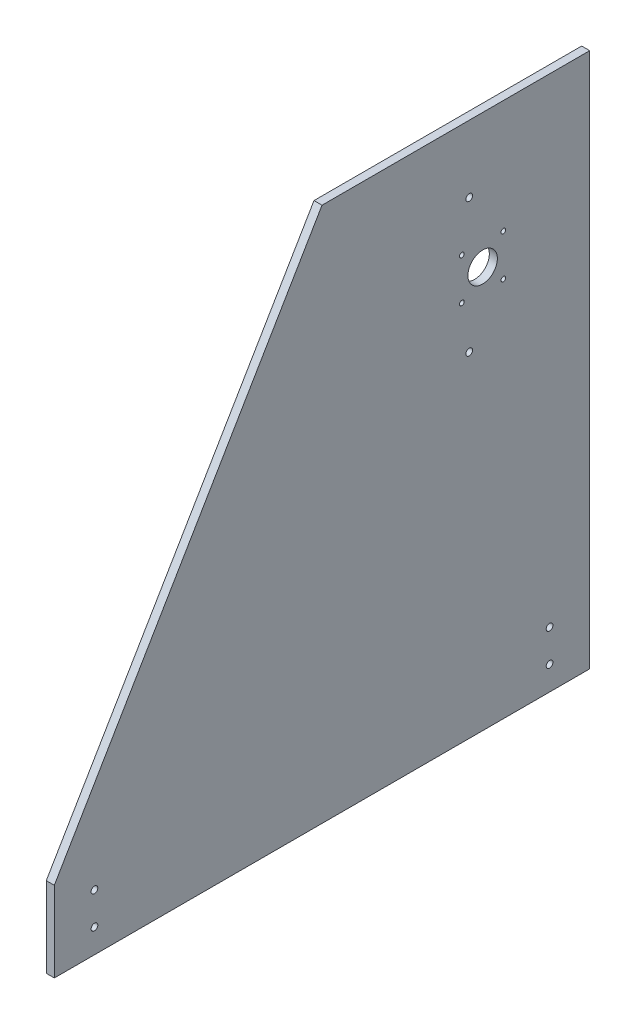
ISO-10303-21;
HEADER;
FILE_DESCRIPTION(('STEP AP214'),'2;1');
FILE_NAME('part.step','',(''),(''),'','','');
FILE_SCHEMA(('AUTOMOTIVE_DESIGN { 1 0 10303 214 1 1 1 1 }'));
ENDSEC;
DATA;
#1=APPLICATION_CONTEXT('core data for automotive mechanical design processes');
#2=APPLICATION_PROTOCOL_DEFINITION('international standard','automotive_design',2000,#1);
#3=PRODUCT_CONTEXT('',#1,'mechanical');
#4=PRODUCT('Part','Part','',(#3));
#5=PRODUCT_RELATED_PRODUCT_CATEGORY('part','',(#4));
#6=PRODUCT_DEFINITION_FORMATION('','',#4);
#7=PRODUCT_DEFINITION_CONTEXT('part definition',#1,'design');
#8=PRODUCT_DEFINITION('design','',#6,#7);
#9=PRODUCT_DEFINITION_SHAPE('','',#8);
#10=(LENGTH_UNIT() NAMED_UNIT(*) SI_UNIT(.MILLI.,.METRE.));
#11=(NAMED_UNIT(*) PLANE_ANGLE_UNIT() SI_UNIT($,.RADIAN.));
#12=(NAMED_UNIT(*) SI_UNIT($,.STERADIAN.) SOLID_ANGLE_UNIT());
#13=UNCERTAINTY_MEASURE_WITH_UNIT(LENGTH_MEASURE(1.E-05),#10,'distance_accuracy_value','');
#14=(GEOMETRIC_REPRESENTATION_CONTEXT(3) GLOBAL_UNCERTAINTY_ASSIGNED_CONTEXT((#13)) GLOBAL_UNIT_ASSIGNED_CONTEXT((#10,
#11,#12)) REPRESENTATION_CONTEXT('',''));
#15=CARTESIAN_POINT('',(0.,0.,0.));
#16=DIRECTION('',(0.,0.,1.));
#17=DIRECTION('',(1.,0.,0.));
#18=AXIS2_PLACEMENT_3D('',#15,#16,#17);
#19=CARTESIAN_POINT('',(6.,0.,0.));
#20=DIRECTION('',(1.,0.,0.));
#21=DIRECTION('',(0.,0.,-1.));
#22=AXIS2_PLACEMENT_3D('',#19,#20,#21);
#23=PLANE('',#22);
#24=CARTESIAN_POINT('',(6.,284.5,-304.5));
#25=DIRECTION('',(1.,0.,0.));
#26=DIRECTION('',(0.,0.,-1.));
#27=AXIS2_PLACEMENT_3D('',#24,#25,#26);
#28=CIRCLE('',#27,1.74999999999998);
#29=CARTESIAN_POINT('',(6.,284.5,-306.25));
#30=VERTEX_POINT('',#29);
#31=EDGE_CURVE('E203',#30,#30,#28,.T.);
#32=ORIENTED_EDGE('',*,*,#31,.F.);
#33=EDGE_LOOP('',(#32));
#34=FACE_BOUND('',#33,.T.);
#35=CARTESIAN_POINT('',(6.,315.5,-335.5));
#36=DIRECTION('',(1.,0.,0.));
#37=DIRECTION('',(0.,0.,-1.));
#38=AXIS2_PLACEMENT_3D('',#35,#36,#37);
#39=CIRCLE('',#38,1.74999999999998);
#40=CARTESIAN_POINT('',(6.,315.5,-337.25));
#41=VERTEX_POINT('',#40);
#42=EDGE_CURVE('E215',#41,#41,#39,.T.);
#43=ORIENTED_EDGE('',*,*,#42,.F.);
#44=EDGE_LOOP('',(#43));
#45=FACE_BOUND('',#44,.T.);
#46=CARTESIAN_POINT('',(6.,250.,-310.));
#47=DIRECTION('',(1.,0.,0.));
#48=DIRECTION('',(0.,0.,-1.));
#49=AXIS2_PLACEMENT_3D('',#46,#47,#48);
#50=CIRCLE('',#49,2.50000000000002);
#51=CARTESIAN_POINT('',(6.,250.,-312.5));
#52=VERTEX_POINT('',#51);
#53=EDGE_CURVE('E227',#52,#52,#50,.T.);
#54=ORIENTED_EDGE('',*,*,#53,.F.);
#55=EDGE_LOOP('',(#54));
#56=FACE_BOUND('',#55,.T.);
#57=CARTESIAN_POINT('',(6.,42.0000000000013,-370.));
#58=DIRECTION('',(1.,0.,0.));
#59=DIRECTION('',(0.,0.,1.));
#60=AXIS2_PLACEMENT_3D('',#57,#58,#59);
#61=CIRCLE('',#60,2.49999999999997);
#62=CARTESIAN_POINT('',(6.,42.0000000000013,-367.5));
#63=VERTEX_POINT('',#62);
#64=EDGE_CURVE('E239',#63,#63,#61,.T.);
#65=ORIENTED_EDGE('',*,*,#64,.F.);
#66=EDGE_LOOP('',(#65));
#67=FACE_BOUND('',#66,.T.);
#68=CARTESIAN_POINT('',(6.,18.,-30.));
#69=DIRECTION('',(1.,0.,0.));
#70=DIRECTION('',(0.,0.,1.));
#71=AXIS2_PLACEMENT_3D('',#68,#69,#70);
#72=CIRCLE('',#71,2.5);
#73=CARTESIAN_POINT('',(6.,18.,-27.5));
#74=VERTEX_POINT('',#73);
#75=EDGE_CURVE('E251',#74,#74,#72,.T.);
#76=ORIENTED_EDGE('',*,*,#75,.F.);
#77=EDGE_LOOP('',(#76));
#78=FACE_BOUND('',#77,.T.);
#79=DIRECTION('',(0.,-1.,0.));
#80=VECTOR('',#79,1.);
#81=CARTESIAN_POINT('',(6.,60.,0.));
#82=LINE('',#81,#80);
#83=CARTESIAN_POINT('',(6.,60.,0.));
#84=VERTEX_POINT('',#83);
#85=CARTESIAN_POINT('',(6.,0.,0.));
#86=VERTEX_POINT('',#85);
#87=EDGE_CURVE('E120',#84,#86,#82,.T.);
#88=ORIENTED_EDGE('',*,*,#87,.T.);
#89=DIRECTION('',(0.,0.,-1.));
#90=VECTOR('',#89,1.);
#91=CARTESIAN_POINT('',(6.,0.,0.));
#92=LINE('',#91,#90);
#93=CARTESIAN_POINT('',(6.,0.,-400.));
#94=VERTEX_POINT('',#93);
#95=EDGE_CURVE('E87',#86,#94,#92,.T.);
#96=ORIENTED_EDGE('',*,*,#95,.T.);
#97=DIRECTION('',(0.,1.,0.));
#98=VECTOR('',#97,1.);
#99=CARTESIAN_POINT('',(6.,0.,-400.));
#100=LINE('',#99,#98);
#101=CARTESIAN_POINT('',(6.,400.,-400.));
#102=VERTEX_POINT('',#101);
#103=EDGE_CURVE('E91',#94,#102,#100,.T.);
#104=ORIENTED_EDGE('',*,*,#103,.T.);
#105=DIRECTION('',(0.,0.,1.));
#106=VECTOR('',#105,1.);
#107=CARTESIAN_POINT('',(6.,400.,-200.));
#108=LINE('',#107,#106);
#109=CARTESIAN_POINT('',(6.,400.,-200.));
#110=VERTEX_POINT('',#109);
#111=EDGE_CURVE('E95',#102,#110,#108,.T.);
#112=ORIENTED_EDGE('',*,*,#111,.T.);
#113=DIRECTION('',(0.,-0.86193421515777,0.507020126563394));
#114=VECTOR('',#113,1.);
#115=CARTESIAN_POINT('',(6.,60.,0.));
#116=LINE('',#115,#114);
#117=EDGE_CURVE('E53',#110,#84,#116,.T.);
#118=ORIENTED_EDGE('',*,*,#117,.T.);
#119=EDGE_LOOP('',(#88,#96,#104,#112,#118));
#120=FACE_BOUND('',#119,.T.);
#121=CARTESIAN_POINT('',(6.,42.,-30.));
#122=DIRECTION('',(1.,0.,0.));
#123=DIRECTION('',(0.,0.,-1.));
#124=AXIS2_PLACEMENT_3D('',#121,#122,#123);
#125=CIRCLE('',#124,2.5);
#126=CARTESIAN_POINT('',(6.,42.,-32.5));
#127=VERTEX_POINT('',#126);
#128=EDGE_CURVE('E115',#127,#127,#125,.T.);
#129=ORIENTED_EDGE('',*,*,#128,.F.);
#130=EDGE_LOOP('',(#129));
#131=FACE_BOUND('',#130,.T.);
#132=CARTESIAN_POINT('',(6.,18.0000000000013,-370.));
#133=DIRECTION('',(1.,0.,0.));
#134=DIRECTION('',(0.,0.,-1.));
#135=AXIS2_PLACEMENT_3D('',#132,#133,#134);
#136=CIRCLE('',#135,2.49999999999997);
#137=CARTESIAN_POINT('',(6.,18.0000000000013,-372.5));
#138=VERTEX_POINT('',#137);
#139=EDGE_CURVE('E245',#138,#138,#136,.T.);
#140=ORIENTED_EDGE('',*,*,#139,.F.);
#141=EDGE_LOOP('',(#140));
#142=FACE_BOUND('',#141,.T.);
#143=CARTESIAN_POINT('',(6.,350.,-310.));
#144=DIRECTION('',(1.,0.,0.));
#145=DIRECTION('',(0.,0.,-1.));
#146=AXIS2_PLACEMENT_3D('',#143,#144,#145);
#147=CIRCLE('',#146,2.50000000000002);
#148=CARTESIAN_POINT('',(6.,350.,-312.5));
#149=VERTEX_POINT('',#148);
#150=EDGE_CURVE('E233',#149,#149,#147,.T.);
#151=ORIENTED_EDGE('',*,*,#150,.F.);
#152=EDGE_LOOP('',(#151));
#153=FACE_BOUND('',#152,.T.);
#154=CARTESIAN_POINT('',(6.,300.,-320.));
#155=DIRECTION('',(1.,0.,0.));
#156=DIRECTION('',(0.,0.,-1.));
#157=AXIS2_PLACEMENT_3D('',#154,#155,#156);
#158=CIRCLE('',#157,11.);
#159=CARTESIAN_POINT('',(6.,300.,-331.));
#160=VERTEX_POINT('',#159);
#161=EDGE_CURVE('E221',#160,#160,#158,.T.);
#162=ORIENTED_EDGE('',*,*,#161,.F.);
#163=EDGE_LOOP('',(#162));
#164=FACE_BOUND('',#163,.T.);
#165=CARTESIAN_POINT('',(6.,315.5,-304.5));
#166=DIRECTION('',(1.,0.,0.));
#167=DIRECTION('',(0.,0.,1.));
#168=AXIS2_PLACEMENT_3D('',#165,#166,#167);
#169=CIRCLE('',#168,1.74999999999998);
#170=CARTESIAN_POINT('',(6.,315.5,-302.75));
#171=VERTEX_POINT('',#170);
#172=EDGE_CURVE('E209',#171,#171,#169,.T.);
#173=ORIENTED_EDGE('',*,*,#172,.F.);
#174=EDGE_LOOP('',(#173));
#175=FACE_BOUND('',#174,.T.);
#176=CARTESIAN_POINT('',(6.,284.5,-335.5));
#177=DIRECTION('',(1.,0.,0.));
#178=DIRECTION('',(0.,0.,1.));
#179=AXIS2_PLACEMENT_3D('',#176,#177,#178);
#180=CIRCLE('',#179,1.74999999999998);
#181=CARTESIAN_POINT('',(6.,284.5,-333.75));
#182=VERTEX_POINT('',#181);
#183=EDGE_CURVE('E194',#182,#182,#180,.T.);
#184=ORIENTED_EDGE('',*,*,#183,.F.);
#185=EDGE_LOOP('',(#184));
#186=FACE_BOUND('',#185,.T.);
#187=ADVANCED_FACE('F36',(#34,#45,#56,#67,#78,#120,#131,#142,#153,#164,#175,#186),#23,.T.);
#188=CARTESIAN_POINT('',(0.,0.,0.));
#189=DIRECTION('',(1.,0.,0.));
#190=DIRECTION('',(0.,0.,-1.));
#191=AXIS2_PLACEMENT_3D('',#188,#189,#190);
#192=PLANE('',#191);
#193=DIRECTION('',(0.,-1.,0.));
#194=VECTOR('',#193,1.);
#195=CARTESIAN_POINT('',(0.,60.,0.));
#196=LINE('',#195,#194);
#197=CARTESIAN_POINT('',(0.,60.,0.));
#198=VERTEX_POINT('',#197);
#199=CARTESIAN_POINT('',(0.,0.,0.));
#200=VERTEX_POINT('',#199);
#201=EDGE_CURVE('E111',#198,#200,#196,.T.);
#202=ORIENTED_EDGE('',*,*,#201,.F.);
#203=DIRECTION('',(0.,-0.86193421515777,0.507020126563394));
#204=VECTOR('',#203,1.);
#205=CARTESIAN_POINT('',(0.,60.,0.));
#206=LINE('',#205,#204);
#207=CARTESIAN_POINT('',(0.,400.,-200.));
#208=VERTEX_POINT('',#207);
#209=EDGE_CURVE('E79',#208,#198,#206,.T.);
#210=ORIENTED_EDGE('',*,*,#209,.F.);
#211=DIRECTION('',(0.,0.,1.));
#212=VECTOR('',#211,1.);
#213=CARTESIAN_POINT('',(0.,400.,-200.));
#214=LINE('',#213,#212);
#215=CARTESIAN_POINT('',(0.,400.,-400.));
#216=VERTEX_POINT('',#215);
#217=EDGE_CURVE('E73',#216,#208,#214,.T.);
#218=ORIENTED_EDGE('',*,*,#217,.F.);
#219=DIRECTION('',(0.,1.,0.));
#220=VECTOR('',#219,1.);
#221=CARTESIAN_POINT('',(0.,0.,-400.));
#222=LINE('',#221,#220);
#223=CARTESIAN_POINT('',(0.,0.,-400.));
#224=VERTEX_POINT('',#223);
#225=EDGE_CURVE('E102',#224,#216,#222,.T.);
#226=ORIENTED_EDGE('',*,*,#225,.F.);
#227=DIRECTION('',(0.,0.,-1.));
#228=VECTOR('',#227,1.);
#229=CARTESIAN_POINT('',(0.,0.,0.));
#230=LINE('',#229,#228);
#231=EDGE_CURVE('E114',#200,#224,#230,.T.);
#232=ORIENTED_EDGE('',*,*,#231,.F.);
#233=EDGE_LOOP('',(#202,#210,#218,#226,#232));
#234=FACE_BOUND('',#233,.T.);
#235=CARTESIAN_POINT('',(0.,42.,-30.));
#236=DIRECTION('',(1.,0.,0.));
#237=DIRECTION('',(0.,0.,-1.));
#238=AXIS2_PLACEMENT_3D('',#235,#236,#237);
#239=CIRCLE('',#238,2.5);
#240=CARTESIAN_POINT('',(0.,42.,-32.5));
#241=VERTEX_POINT('',#240);
#242=EDGE_CURVE('E254',#241,#241,#239,.T.);
#243=ORIENTED_EDGE('',*,*,#242,.T.);
#244=EDGE_LOOP('',(#243));
#245=FACE_BOUND('',#244,.T.);
#246=CARTESIAN_POINT('',(0.,18.,-30.));
#247=DIRECTION('',(1.,0.,0.));
#248=DIRECTION('',(0.,0.,1.));
#249=AXIS2_PLACEMENT_3D('',#246,#247,#248);
#250=CIRCLE('',#249,2.5);
#251=CARTESIAN_POINT('',(0.,18.,-27.5));
#252=VERTEX_POINT('',#251);
#253=EDGE_CURVE('E248',#252,#252,#250,.T.);
#254=ORIENTED_EDGE('',*,*,#253,.T.);
#255=EDGE_LOOP('',(#254));
#256=FACE_BOUND('',#255,.T.);
#257=CARTESIAN_POINT('',(0.,18.0000000000013,-370.));
#258=DIRECTION('',(1.,0.,0.));
#259=DIRECTION('',(0.,0.,-1.));
#260=AXIS2_PLACEMENT_3D('',#257,#258,#259);
#261=CIRCLE('',#260,2.49999999999997);
#262=CARTESIAN_POINT('',(0.,18.0000000000013,-372.5));
#263=VERTEX_POINT('',#262);
#264=EDGE_CURVE('E242',#263,#263,#261,.T.);
#265=ORIENTED_EDGE('',*,*,#264,.T.);
#266=EDGE_LOOP('',(#265));
#267=FACE_BOUND('',#266,.T.);
#268=CARTESIAN_POINT('',(0.,42.0000000000013,-370.));
#269=DIRECTION('',(1.,0.,0.));
#270=DIRECTION('',(0.,0.,1.));
#271=AXIS2_PLACEMENT_3D('',#268,#269,#270);
#272=CIRCLE('',#271,2.49999999999997);
#273=CARTESIAN_POINT('',(0.,42.0000000000013,-367.5));
#274=VERTEX_POINT('',#273);
#275=EDGE_CURVE('E236',#274,#274,#272,.T.);
#276=ORIENTED_EDGE('',*,*,#275,.T.);
#277=EDGE_LOOP('',(#276));
#278=FACE_BOUND('',#277,.T.);
#279=CARTESIAN_POINT('',(0.,350.,-310.));
#280=DIRECTION('',(1.,0.,0.));
#281=DIRECTION('',(0.,0.,-1.));
#282=AXIS2_PLACEMENT_3D('',#279,#280,#281);
#283=CIRCLE('',#282,2.50000000000002);
#284=CARTESIAN_POINT('',(0.,350.,-312.5));
#285=VERTEX_POINT('',#284);
#286=EDGE_CURVE('E230',#285,#285,#283,.T.);
#287=ORIENTED_EDGE('',*,*,#286,.T.);
#288=EDGE_LOOP('',(#287));
#289=FACE_BOUND('',#288,.T.);
#290=CARTESIAN_POINT('',(0.,250.,-310.));
#291=DIRECTION('',(1.,0.,0.));
#292=DIRECTION('',(0.,0.,-1.));
#293=AXIS2_PLACEMENT_3D('',#290,#291,#292);
#294=CIRCLE('',#293,2.50000000000002);
#295=CARTESIAN_POINT('',(0.,250.,-312.5));
#296=VERTEX_POINT('',#295);
#297=EDGE_CURVE('E224',#296,#296,#294,.T.);
#298=ORIENTED_EDGE('',*,*,#297,.T.);
#299=EDGE_LOOP('',(#298));
#300=FACE_BOUND('',#299,.T.);
#301=CARTESIAN_POINT('',(0.,300.,-320.));
#302=DIRECTION('',(1.,0.,0.));
#303=DIRECTION('',(0.,0.,-1.));
#304=AXIS2_PLACEMENT_3D('',#301,#302,#303);
#305=CIRCLE('',#304,11.);
#306=CARTESIAN_POINT('',(0.,300.,-331.));
#307=VERTEX_POINT('',#306);
#308=EDGE_CURVE('E218',#307,#307,#305,.T.);
#309=ORIENTED_EDGE('',*,*,#308,.T.);
#310=EDGE_LOOP('',(#309));
#311=FACE_BOUND('',#310,.T.);
#312=CARTESIAN_POINT('',(0.,315.5,-335.5));
#313=DIRECTION('',(1.,0.,0.));
#314=DIRECTION('',(0.,0.,-1.));
#315=AXIS2_PLACEMENT_3D('',#312,#313,#314);
#316=CIRCLE('',#315,1.74999999999998);
#317=CARTESIAN_POINT('',(0.,315.5,-337.25));
#318=VERTEX_POINT('',#317);
#319=EDGE_CURVE('E212',#318,#318,#316,.T.);
#320=ORIENTED_EDGE('',*,*,#319,.T.);
#321=EDGE_LOOP('',(#320));
#322=FACE_BOUND('',#321,.T.);
#323=CARTESIAN_POINT('',(0.,315.5,-304.5));
#324=DIRECTION('',(1.,0.,0.));
#325=DIRECTION('',(0.,0.,1.));
#326=AXIS2_PLACEMENT_3D('',#323,#324,#325);
#327=CIRCLE('',#326,1.74999999999998);
#328=CARTESIAN_POINT('',(0.,315.5,-302.75));
#329=VERTEX_POINT('',#328);
#330=EDGE_CURVE('E206',#329,#329,#327,.T.);
#331=ORIENTED_EDGE('',*,*,#330,.T.);
#332=EDGE_LOOP('',(#331));
#333=FACE_BOUND('',#332,.T.);
#334=CARTESIAN_POINT('',(0.,284.5,-304.5));
#335=DIRECTION('',(1.,0.,0.));
#336=DIRECTION('',(0.,0.,-1.));
#337=AXIS2_PLACEMENT_3D('',#334,#335,#336);
#338=CIRCLE('',#337,1.74999999999998);
#339=CARTESIAN_POINT('',(0.,284.5,-306.25));
#340=VERTEX_POINT('',#339);
#341=EDGE_CURVE('E200',#340,#340,#338,.T.);
#342=ORIENTED_EDGE('',*,*,#341,.T.);
#343=EDGE_LOOP('',(#342));
#344=FACE_BOUND('',#343,.T.);
#345=CARTESIAN_POINT('',(0.,284.5,-335.5));
#346=DIRECTION('',(1.,0.,0.));
#347=DIRECTION('',(0.,0.,1.));
#348=AXIS2_PLACEMENT_3D('',#345,#346,#347);
#349=CIRCLE('',#348,1.74999999999998);
#350=CARTESIAN_POINT('',(0.,284.5,-333.75));
#351=VERTEX_POINT('',#350);
#352=EDGE_CURVE('E197',#351,#351,#349,.T.);
#353=ORIENTED_EDGE('',*,*,#352,.T.);
#354=EDGE_LOOP('',(#353));
#355=FACE_BOUND('',#354,.T.);
#356=ADVANCED_FACE('F124',(#234,#245,#256,#267,#278,#289,#300,#311,#322,#333,#344,#355),#192,.F.);
#357=CARTESIAN_POINT('',(6.,60.,0.));
#358=DIRECTION('',(0.,0.,-1.));
#359=DIRECTION('',(-1.,0.,0.));
#360=AXIS2_PLACEMENT_3D('',#357,#358,#359);
#361=PLANE('',#360);
#362=ORIENTED_EDGE('',*,*,#201,.T.);
#363=DIRECTION('',(-1.,0.,0.));
#364=VECTOR('',#363,1.);
#365=CARTESIAN_POINT('',(6.,0.,0.));
#366=LINE('',#365,#364);
#367=EDGE_CURVE('E11',#86,#200,#366,.T.);
#368=ORIENTED_EDGE('',*,*,#367,.F.);
#369=ORIENTED_EDGE('',*,*,#87,.F.);
#370=DIRECTION('',(-1.,0.,0.));
#371=VECTOR('',#370,1.);
#372=CARTESIAN_POINT('',(6.,60.,0.));
#373=LINE('',#372,#371);
#374=EDGE_CURVE('E107',#84,#198,#373,.T.);
#375=ORIENTED_EDGE('',*,*,#374,.T.);
#376=EDGE_LOOP('',(#362,#368,#369,#375));
#377=FACE_BOUND('',#376,.T.);
#378=ADVANCED_FACE('F38',(#377),#361,.F.);
#379=CARTESIAN_POINT('',(6.,0.,0.));
#380=DIRECTION('',(0.,1.,0.));
#381=DIRECTION('',(0.,0.,1.));
#382=AXIS2_PLACEMENT_3D('',#379,#380,#381);
#383=PLANE('',#382);
#384=ORIENTED_EDGE('',*,*,#231,.T.);
#385=DIRECTION('',(-1.,0.,0.));
#386=VECTOR('',#385,1.);
#387=CARTESIAN_POINT('',(6.,0.,-400.));
#388=LINE('',#387,#386);
#389=EDGE_CURVE('E45',#94,#224,#388,.T.);
#390=ORIENTED_EDGE('',*,*,#389,.F.);
#391=ORIENTED_EDGE('',*,*,#95,.F.);
#392=ORIENTED_EDGE('',*,*,#367,.T.);
#393=EDGE_LOOP('',(#384,#390,#391,#392));
#394=FACE_BOUND('',#393,.T.);
#395=ADVANCED_FACE('F366',(#394),#383,.F.);
#396=CARTESIAN_POINT('',(6.,0.,-400.));
#397=DIRECTION('',(0.,0.,1.));
#398=DIRECTION('',(1.,0.,0.));
#399=AXIS2_PLACEMENT_3D('',#396,#397,#398);
#400=PLANE('',#399);
#401=ORIENTED_EDGE('',*,*,#225,.T.);
#402=DIRECTION('',(-1.,0.,0.));
#403=VECTOR('',#402,1.);
#404=CARTESIAN_POINT('',(6.,400.,-400.));
#405=LINE('',#404,#403);
#406=EDGE_CURVE('E99',#102,#216,#405,.T.);
#407=ORIENTED_EDGE('',*,*,#406,.F.);
#408=ORIENTED_EDGE('',*,*,#103,.F.);
#409=ORIENTED_EDGE('',*,*,#389,.T.);
#410=EDGE_LOOP('',(#401,#407,#408,#409));
#411=FACE_BOUND('',#410,.T.);
#412=ADVANCED_FACE('F100',(#411),#400,.F.);
#413=CARTESIAN_POINT('',(6.,400.,-200.));
#414=DIRECTION('',(0.,-1.,0.));
#415=DIRECTION('',(0.,0.,-1.));
#416=AXIS2_PLACEMENT_3D('',#413,#414,#415);
#417=PLANE('',#416);
#418=ORIENTED_EDGE('',*,*,#217,.T.);
#419=DIRECTION('',(-1.,0.,0.));
#420=VECTOR('',#419,1.);
#421=CARTESIAN_POINT('',(6.,400.,-200.));
#422=LINE('',#421,#420);
#423=EDGE_CURVE('E103',#110,#208,#422,.T.);
#424=ORIENTED_EDGE('',*,*,#423,.F.);
#425=ORIENTED_EDGE('',*,*,#111,.F.);
#426=ORIENTED_EDGE('',*,*,#406,.T.);
#427=EDGE_LOOP('',(#418,#424,#425,#426));
#428=FACE_BOUND('',#427,.T.);
#429=ADVANCED_FACE('F105',(#428),#417,.F.);
#430=CARTESIAN_POINT('',(6.,60.,0.));
#431=DIRECTION('',(0.,-0.507020126563394,-0.86193421515777));
#432=DIRECTION('',(0.,0.86193421515777,-0.507020126563394));
#433=AXIS2_PLACEMENT_3D('',#430,#431,#432);
#434=PLANE('',#433);
#435=ORIENTED_EDGE('',*,*,#209,.T.);
#436=ORIENTED_EDGE('',*,*,#374,.F.);
#437=ORIENTED_EDGE('',*,*,#117,.F.);
#438=ORIENTED_EDGE('',*,*,#423,.T.);
#439=EDGE_LOOP('',(#435,#436,#437,#438));
#440=FACE_BOUND('',#439,.T.);
#441=ADVANCED_FACE('F129',(#440),#434,.F.);
#442=CARTESIAN_POINT('',(6.,42.,-30.));
#443=DIRECTION('',(-1.,0.,0.));
#444=DIRECTION('',(0.,0.,1.));
#445=AXIS2_PLACEMENT_3D('',#442,#443,#444);
#446=CYLINDRICAL_SURFACE('',#445,2.5);
#447=ORIENTED_EDGE('',*,*,#128,.T.);
#448=EDGE_LOOP('',(#447));
#449=FACE_BOUND('',#448,.T.);
#450=ORIENTED_EDGE('',*,*,#242,.F.);
#451=EDGE_LOOP('',(#450));
#452=FACE_BOUND('',#451,.T.);
#453=ADVANCED_FACE('F131',(#449,#452),#446,.F.);
#454=CARTESIAN_POINT('',(6.,18.,-30.));
#455=DIRECTION('',(-1.,0.,0.));
#456=DIRECTION('',(0.,0.,1.));
#457=AXIS2_PLACEMENT_3D('',#454,#455,#456);
#458=CYLINDRICAL_SURFACE('',#457,2.5);
#459=ORIENTED_EDGE('',*,*,#75,.T.);
#460=EDGE_LOOP('',(#459));
#461=FACE_BOUND('',#460,.T.);
#462=ORIENTED_EDGE('',*,*,#253,.F.);
#463=EDGE_LOOP('',(#462));
#464=FACE_BOUND('',#463,.T.);
#465=ADVANCED_FACE('F137',(#461,#464),#458,.F.);
#466=CARTESIAN_POINT('',(6.,18.0000000000013,-370.));
#467=DIRECTION('',(-1.,0.,0.));
#468=DIRECTION('',(0.,0.,1.));
#469=AXIS2_PLACEMENT_3D('',#466,#467,#468);
#470=CYLINDRICAL_SURFACE('',#469,2.49999999999997);
#471=ORIENTED_EDGE('',*,*,#139,.T.);
#472=EDGE_LOOP('',(#471));
#473=FACE_BOUND('',#472,.T.);
#474=ORIENTED_EDGE('',*,*,#264,.F.);
#475=EDGE_LOOP('',(#474));
#476=FACE_BOUND('',#475,.T.);
#477=ADVANCED_FACE('F153',(#473,#476),#470,.F.);
#478=CARTESIAN_POINT('',(6.,42.0000000000013,-370.));
#479=DIRECTION('',(-1.,0.,0.));
#480=DIRECTION('',(0.,0.,1.));
#481=AXIS2_PLACEMENT_3D('',#478,#479,#480);
#482=CYLINDRICAL_SURFACE('',#481,2.49999999999997);
#483=ORIENTED_EDGE('',*,*,#64,.T.);
#484=EDGE_LOOP('',(#483));
#485=FACE_BOUND('',#484,.T.);
#486=ORIENTED_EDGE('',*,*,#275,.F.);
#487=EDGE_LOOP('',(#486));
#488=FACE_BOUND('',#487,.T.);
#489=ADVANCED_FACE('F157',(#485,#488),#482,.F.);
#490=CARTESIAN_POINT('',(6.,350.,-310.));
#491=DIRECTION('',(-1.,0.,0.));
#492=DIRECTION('',(0.,0.,1.));
#493=AXIS2_PLACEMENT_3D('',#490,#491,#492);
#494=CYLINDRICAL_SURFACE('',#493,2.50000000000002);
#495=ORIENTED_EDGE('',*,*,#150,.T.);
#496=EDGE_LOOP('',(#495));
#497=FACE_BOUND('',#496,.T.);
#498=ORIENTED_EDGE('',*,*,#286,.F.);
#499=EDGE_LOOP('',(#498));
#500=FACE_BOUND('',#499,.T.);
#501=ADVANCED_FACE('F161',(#497,#500),#494,.F.);
#502=CARTESIAN_POINT('',(6.,250.,-310.));
#503=DIRECTION('',(-1.,0.,0.));
#504=DIRECTION('',(0.,0.,1.));
#505=AXIS2_PLACEMENT_3D('',#502,#503,#504);
#506=CYLINDRICAL_SURFACE('',#505,2.50000000000002);
#507=ORIENTED_EDGE('',*,*,#53,.T.);
#508=EDGE_LOOP('',(#507));
#509=FACE_BOUND('',#508,.T.);
#510=ORIENTED_EDGE('',*,*,#297,.F.);
#511=EDGE_LOOP('',(#510));
#512=FACE_BOUND('',#511,.T.);
#513=ADVANCED_FACE('F165',(#509,#512),#506,.F.);
#514=CARTESIAN_POINT('',(6.,300.,-320.));
#515=DIRECTION('',(-1.,0.,0.));
#516=DIRECTION('',(0.,0.,1.));
#517=AXIS2_PLACEMENT_3D('',#514,#515,#516);
#518=CYLINDRICAL_SURFACE('',#517,11.);
#519=ORIENTED_EDGE('',*,*,#161,.T.);
#520=EDGE_LOOP('',(#519));
#521=FACE_BOUND('',#520,.T.);
#522=ORIENTED_EDGE('',*,*,#308,.F.);
#523=EDGE_LOOP('',(#522));
#524=FACE_BOUND('',#523,.T.);
#525=ADVANCED_FACE('F169',(#521,#524),#518,.F.);
#526=CARTESIAN_POINT('',(6.,315.5,-335.5));
#527=DIRECTION('',(-1.,0.,0.));
#528=DIRECTION('',(0.,0.,1.));
#529=AXIS2_PLACEMENT_3D('',#526,#527,#528);
#530=CYLINDRICAL_SURFACE('',#529,1.74999999999998);
#531=ORIENTED_EDGE('',*,*,#42,.T.);
#532=EDGE_LOOP('',(#531));
#533=FACE_BOUND('',#532,.T.);
#534=ORIENTED_EDGE('',*,*,#319,.F.);
#535=EDGE_LOOP('',(#534));
#536=FACE_BOUND('',#535,.T.);
#537=ADVANCED_FACE('F173',(#533,#536),#530,.F.);
#538=CARTESIAN_POINT('',(6.,315.5,-304.5));
#539=DIRECTION('',(-1.,0.,0.));
#540=DIRECTION('',(0.,0.,1.));
#541=AXIS2_PLACEMENT_3D('',#538,#539,#540);
#542=CYLINDRICAL_SURFACE('',#541,1.74999999999998);
#543=ORIENTED_EDGE('',*,*,#172,.T.);
#544=EDGE_LOOP('',(#543));
#545=FACE_BOUND('',#544,.T.);
#546=ORIENTED_EDGE('',*,*,#330,.F.);
#547=EDGE_LOOP('',(#546));
#548=FACE_BOUND('',#547,.T.);
#549=ADVANCED_FACE('F177',(#545,#548),#542,.F.);
#550=CARTESIAN_POINT('',(6.,284.5,-304.5));
#551=DIRECTION('',(-1.,0.,0.));
#552=DIRECTION('',(0.,0.,1.));
#553=AXIS2_PLACEMENT_3D('',#550,#551,#552);
#554=CYLINDRICAL_SURFACE('',#553,1.74999999999998);
#555=ORIENTED_EDGE('',*,*,#31,.T.);
#556=EDGE_LOOP('',(#555));
#557=FACE_BOUND('',#556,.T.);
#558=ORIENTED_EDGE('',*,*,#341,.F.);
#559=EDGE_LOOP('',(#558));
#560=FACE_BOUND('',#559,.T.);
#561=ADVANCED_FACE('F181',(#557,#560),#554,.F.);
#562=CARTESIAN_POINT('',(6.,284.5,-335.5));
#563=DIRECTION('',(-1.,0.,0.));
#564=DIRECTION('',(0.,0.,1.));
#565=AXIS2_PLACEMENT_3D('',#562,#563,#564);
#566=CYLINDRICAL_SURFACE('',#565,1.74999999999998);
#567=ORIENTED_EDGE('',*,*,#183,.T.);
#568=EDGE_LOOP('',(#567));
#569=FACE_BOUND('',#568,.T.);
#570=ORIENTED_EDGE('',*,*,#352,.F.);
#571=EDGE_LOOP('',(#570));
#572=FACE_BOUND('',#571,.T.);
#573=ADVANCED_FACE('F185',(#569,#572),#566,.F.);
#574=CLOSED_SHELL('',(#187,#356,#378,#395,#412,#429,#441,#453,#465,#477,#489,#501,#513,#525,
#537,#549,#561,#573));
#575=MANIFOLD_SOLID_BREP('B2',#574);
#576=ADVANCED_BREP_SHAPE_REPRESENTATION('',(#18,#575),#14);
#577=SHAPE_DEFINITION_REPRESENTATION(#9,#576);
ENDSEC;
END-ISO-10303-21;
